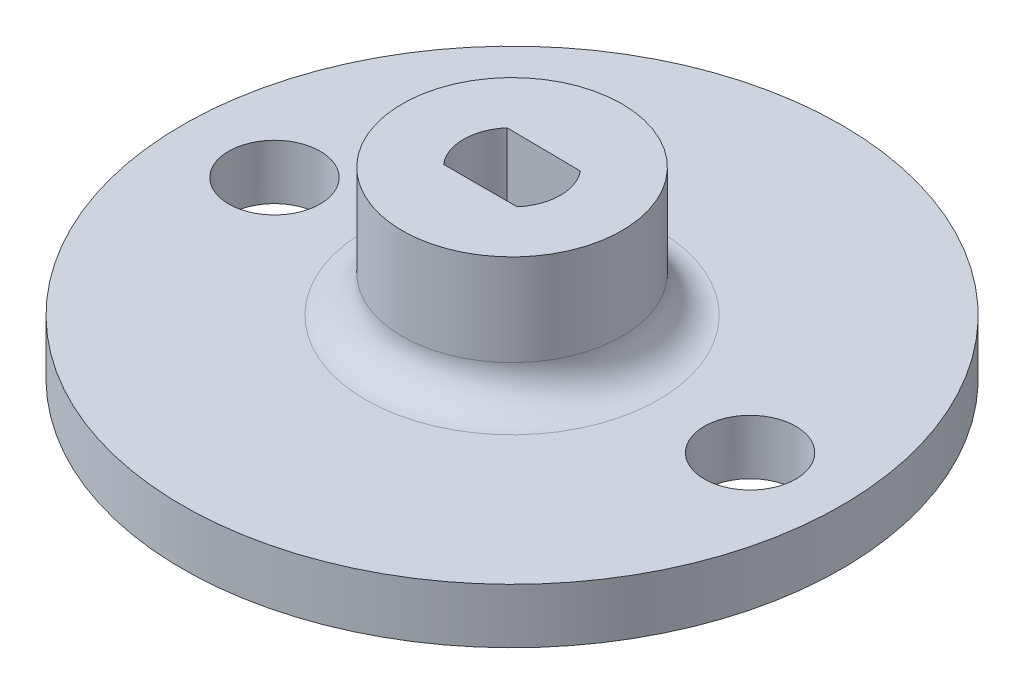
ISO-10303-21;
HEADER;
FILE_DESCRIPTION(('STEP AP214'),'2;1');
FILE_NAME('part.step','',(''),(''),'','','');
FILE_SCHEMA(('AUTOMOTIVE_DESIGN { 1 0 10303 214 1 1 1 1 }'));
ENDSEC;
DATA;
#1=APPLICATION_CONTEXT('core data for automotive mechanical design processes');
#2=APPLICATION_PROTOCOL_DEFINITION('international standard','automotive_design',2000,#1);
#3=PRODUCT_CONTEXT('',#1,'mechanical');
#4=PRODUCT('Part','Part','',(#3));
#5=PRODUCT_RELATED_PRODUCT_CATEGORY('part','',(#4));
#6=PRODUCT_DEFINITION_FORMATION('','',#4);
#7=PRODUCT_DEFINITION_CONTEXT('part definition',#1,'design');
#8=PRODUCT_DEFINITION('design','',#6,#7);
#9=PRODUCT_DEFINITION_SHAPE('','',#8);
#10=(LENGTH_UNIT() NAMED_UNIT(*) SI_UNIT(.MILLI.,.METRE.));
#11=(NAMED_UNIT(*) PLANE_ANGLE_UNIT() SI_UNIT($,.RADIAN.));
#12=(NAMED_UNIT(*) SI_UNIT($,.STERADIAN.) SOLID_ANGLE_UNIT());
#13=UNCERTAINTY_MEASURE_WITH_UNIT(LENGTH_MEASURE(1.E-05),#10,'distance_accuracy_value','');
#14=(GEOMETRIC_REPRESENTATION_CONTEXT(3) GLOBAL_UNCERTAINTY_ASSIGNED_CONTEXT((#13)) GLOBAL_UNIT_ASSIGNED_CONTEXT((#10,
#11,#12)) REPRESENTATION_CONTEXT('',''));
#15=CARTESIAN_POINT('',(0.,0.,0.));
#16=DIRECTION('',(0.,0.,1.));
#17=DIRECTION('',(1.,0.,0.));
#18=AXIS2_PLACEMENT_3D('',#15,#16,#17);
#19=CARTESIAN_POINT('',(0.,7.,0.));
#20=DIRECTION('',(0.,-1.,0.));
#21=DIRECTION('',(0.,0.,-1.));
#22=AXIS2_PLACEMENT_3D('',#19,#20,#21);
#23=CYLINDRICAL_SURFACE('',#22,6.);
#24=CARTESIAN_POINT('',(0.,2.,0.));
#25=DIRECTION('',(0.,-1.,0.));
#26=DIRECTION('',(0.,0.,-1.));
#27=AXIS2_PLACEMENT_3D('',#24,#25,#26);
#28=CIRCLE('',#27,6.);
#29=CARTESIAN_POINT('',(0.,2.,-6.));
#30=VERTEX_POINT('',#29);
#31=EDGE_CURVE('E43',#30,#30,#28,.F.);
#32=ORIENTED_EDGE('',*,*,#31,.T.);
#33=EDGE_LOOP('',(#32));
#34=FACE_BOUND('',#33,.T.);
#35=CARTESIAN_POINT('',(0.,7.,0.));
#36=DIRECTION('',(0.,1.,0.));
#37=DIRECTION('',(0.,0.,1.));
#38=AXIS2_PLACEMENT_3D('',#35,#36,#37);
#39=CIRCLE('',#38,6.);
#40=CARTESIAN_POINT('',(0.,7.,6.));
#41=VERTEX_POINT('',#40);
#42=EDGE_CURVE('E129',#41,#41,#39,.T.);
#43=ORIENTED_EDGE('',*,*,#42,.F.);
#44=EDGE_LOOP('',(#43));
#45=FACE_BOUND('',#44,.T.);
#46=ADVANCED_FACE('F35',(#34,#45),#23,.T.);
#47=CARTESIAN_POINT('',(0.,7.,0.));
#48=DIRECTION('',(0.,1.,0.));
#49=DIRECTION('',(0.,0.,1.));
#50=AXIS2_PLACEMENT_3D('',#47,#48,#49);
#51=PLANE('',#50);
#52=CARTESIAN_POINT('',(0.,7.,0.));
#53=DIRECTION('',(0.,1.,0.));
#54=DIRECTION('',(0.,0.,1.));
#55=AXIS2_PLACEMENT_3D('',#52,#53,#54);
#56=CIRCLE('',#55,2.65);
#57=CARTESIAN_POINT('',(-2.00415427824691,7.,-1.73374324194346));
#58=VERTEX_POINT('',#57);
#59=CARTESIAN_POINT('',(-2.00415427824691,7.,1.73374324194346));
#60=VERTEX_POINT('',#59);
#61=EDGE_CURVE('E50',#58,#60,#56,.T.);
#62=ORIENTED_EDGE('',*,*,#61,.F.);
#63=DIRECTION('',(-0.999932681439029,0.,-0.0116031284640242));
#64=VECTOR('',#63,1.);
#65=CARTESIAN_POINT('',(-2.00415427824691,7.,-1.73374324194346));
#66=LINE('',#65,#64);
#67=CARTESIAN_POINT('',(2.04384561192943,7.,-1.68677061706588));
#68=VERTEX_POINT('',#67);
#69=EDGE_CURVE('E101',#68,#58,#66,.T.);
#70=ORIENTED_EDGE('',*,*,#69,.F.);
#71=CARTESIAN_POINT('',(0.,7.,0.));
#72=DIRECTION('',(0.,1.,0.));
#73=DIRECTION('',(0.,0.,1.));
#74=AXIS2_PLACEMENT_3D('',#71,#72,#73);
#75=CIRCLE('',#74,2.65);
#76=CARTESIAN_POINT('',(2.00415427824691,7.,1.73374324194346));
#77=VERTEX_POINT('',#76);
#78=EDGE_CURVE('E107',#77,#68,#75,.T.);
#79=ORIENTED_EDGE('',*,*,#78,.F.);
#80=DIRECTION('',(1.,0.,0.));
#81=VECTOR('',#80,1.);
#82=CARTESIAN_POINT('',(-2.00415427824691,7.,1.73374324194346));
#83=LINE('',#82,#81);
#84=EDGE_CURVE('E85',#60,#77,#83,.T.);
#85=ORIENTED_EDGE('',*,*,#84,.F.);
#86=EDGE_LOOP('',(#62,#70,#79,#85));
#87=FACE_BOUND('',#86,.T.);
#88=ORIENTED_EDGE('',*,*,#42,.T.);
#89=EDGE_LOOP('',(#88));
#90=FACE_BOUND('',#89,.T.);
#91=ADVANCED_FACE('F154',(#87,#90),#51,.T.);
#92=CARTESIAN_POINT('',(0.,-3.,0.));
#93=DIRECTION('',(0.,1.,0.));
#94=DIRECTION('',(0.,0.,1.));
#95=AXIS2_PLACEMENT_3D('',#92,#93,#94);
#96=CYLINDRICAL_SURFACE('',#95,18.);
#97=CARTESIAN_POINT('',(0.,-3.,0.));
#98=DIRECTION('',(0.,-1.,0.));
#99=DIRECTION('',(0.,0.,-1.));
#100=AXIS2_PLACEMENT_3D('',#97,#98,#99);
#101=CIRCLE('',#100,18.);
#102=CARTESIAN_POINT('',(0.,-3.,-18.));
#103=VERTEX_POINT('',#102);
#104=EDGE_CURVE('E126',#103,#103,#101,.T.);
#105=ORIENTED_EDGE('',*,*,#104,.F.);
#106=EDGE_LOOP('',(#105));
#107=FACE_BOUND('',#106,.T.);
#108=CARTESIAN_POINT('',(0.,0.,0.));
#109=DIRECTION('',(0.,-1.,0.));
#110=DIRECTION('',(0.,0.,-1.));
#111=AXIS2_PLACEMENT_3D('',#108,#109,#110);
#112=CIRCLE('',#111,18.);
#113=CARTESIAN_POINT('',(0.,0.,-18.));
#114=VERTEX_POINT('',#113);
#115=EDGE_CURVE('E125',#114,#114,#112,.T.);
#116=ORIENTED_EDGE('',*,*,#115,.T.);
#117=EDGE_LOOP('',(#116));
#118=FACE_BOUND('',#117,.T.);
#119=ADVANCED_FACE('F159',(#107,#118),#96,.T.);
#120=CARTESIAN_POINT('',(0.,-3.,0.));
#121=DIRECTION('',(0.,-1.,0.));
#122=DIRECTION('',(0.,0.,-1.));
#123=AXIS2_PLACEMENT_3D('',#120,#121,#122);
#124=PLANE('',#123);
#125=CARTESIAN_POINT('',(13.,-3.,0.));
#126=DIRECTION('',(0.,-1.,0.));
#127=DIRECTION('',(0.,0.,-1.));
#128=AXIS2_PLACEMENT_3D('',#125,#126,#127);
#129=CIRCLE('',#128,2.5);
#130=CARTESIAN_POINT('',(13.,-3.,-2.5));
#131=VERTEX_POINT('',#130);
#132=EDGE_CURVE('E122',#131,#131,#129,.T.);
#133=ORIENTED_EDGE('',*,*,#132,.F.);
#134=EDGE_LOOP('',(#133));
#135=FACE_BOUND('',#134,.T.);
#136=CARTESIAN_POINT('',(-13.,-3.,-0.0220781952834113));
#137=DIRECTION('',(0.,-1.,0.));
#138=DIRECTION('',(0.,0.,-1.));
#139=AXIS2_PLACEMENT_3D('',#136,#137,#138);
#140=CIRCLE('',#139,2.5);
#141=CARTESIAN_POINT('',(-13.,-3.,-2.52207819528341));
#142=VERTEX_POINT('',#141);
#143=EDGE_CURVE('E117',#142,#142,#140,.T.);
#144=ORIENTED_EDGE('',*,*,#143,.F.);
#145=EDGE_LOOP('',(#144));
#146=FACE_BOUND('',#145,.T.);
#147=ORIENTED_EDGE('',*,*,#104,.T.);
#148=EDGE_LOOP('',(#147));
#149=FACE_BOUND('',#148,.T.);
#150=ADVANCED_FACE('F149',(#135,#146,#149),#124,.T.);
#151=CARTESIAN_POINT('',(0.,0.,0.));
#152=DIRECTION('',(0.,-1.,0.));
#153=DIRECTION('',(0.,0.,-1.));
#154=AXIS2_PLACEMENT_3D('',#151,#152,#153);
#155=PLANE('',#154);
#156=CARTESIAN_POINT('',(13.,0.,0.));
#157=DIRECTION('',(0.,1.,0.));
#158=DIRECTION('',(0.,0.,1.));
#159=AXIS2_PLACEMENT_3D('',#156,#157,#158);
#160=CIRCLE('',#159,2.5);
#161=CARTESIAN_POINT('',(13.,0.,2.5));
#162=VERTEX_POINT('',#161);
#163=EDGE_CURVE('E114',#162,#162,#160,.T.);
#164=ORIENTED_EDGE('',*,*,#163,.F.);
#165=EDGE_LOOP('',(#164));
#166=FACE_BOUND('',#165,.T.);
#167=CARTESIAN_POINT('',(-13.,0.,-0.0220781952834113));
#168=DIRECTION('',(0.,1.,0.));
#169=DIRECTION('',(0.,0.,1.));
#170=AXIS2_PLACEMENT_3D('',#167,#168,#169);
#171=CIRCLE('',#170,2.5);
#172=CARTESIAN_POINT('',(-13.,0.,2.47792180471659));
#173=VERTEX_POINT('',#172);
#174=EDGE_CURVE('E111',#173,#173,#171,.T.);
#175=ORIENTED_EDGE('',*,*,#174,.F.);
#176=EDGE_LOOP('',(#175));
#177=FACE_BOUND('',#176,.T.);
#178=CARTESIAN_POINT('',(0.,0.,0.));
#179=DIRECTION('',(0.,-1.,0.));
#180=DIRECTION('',(0.,0.,-1.));
#181=AXIS2_PLACEMENT_3D('',#178,#179,#180);
#182=CIRCLE('',#181,8.);
#183=CARTESIAN_POINT('',(0.,0.,-8.));
#184=VERTEX_POINT('',#183);
#185=EDGE_CURVE('E11',#184,#184,#182,.T.);
#186=ORIENTED_EDGE('',*,*,#185,.T.);
#187=EDGE_LOOP('',(#186));
#188=FACE_BOUND('',#187,.T.);
#189=ORIENTED_EDGE('',*,*,#115,.F.);
#190=EDGE_LOOP('',(#189));
#191=FACE_BOUND('',#190,.T.);
#192=ADVANCED_FACE('F140',(#166,#177,#188,#191),#155,.F.);
#193=CARTESIAN_POINT('',(0.,2.,0.));
#194=DIRECTION('',(0.,-1.,0.));
#195=DIRECTION('',(0.,0.,-1.));
#196=AXIS2_PLACEMENT_3D('',#193,#194,#195);
#197=TOROIDAL_SURFACE('',#196,8.,2.);
#198=ORIENTED_EDGE('',*,*,#185,.F.);
#199=EDGE_LOOP('',(#198));
#200=FACE_BOUND('',#199,.T.);
#201=ORIENTED_EDGE('',*,*,#31,.F.);
#202=EDGE_LOOP('',(#201));
#203=FACE_BOUND('',#202,.T.);
#204=ADVANCED_FACE('F37',(#200,#203),#197,.F.);
#205=CARTESIAN_POINT('',(-13.,-6.,-0.0220781952834113));
#206=DIRECTION('',(0.,1.,0.));
#207=DIRECTION('',(0.,0.,1.));
#208=AXIS2_PLACEMENT_3D('',#205,#206,#207);
#209=CYLINDRICAL_SURFACE('',#208,2.5);
#210=ORIENTED_EDGE('',*,*,#143,.T.);
#211=EDGE_LOOP('',(#210));
#212=FACE_BOUND('',#211,.T.);
#213=ORIENTED_EDGE('',*,*,#174,.T.);
#214=EDGE_LOOP('',(#213));
#215=FACE_BOUND('',#214,.T.);
#216=ADVANCED_FACE('F139',(#212,#215),#209,.F.);
#217=CARTESIAN_POINT('',(13.,-6.,0.));
#218=DIRECTION('',(0.,1.,0.));
#219=DIRECTION('',(0.,0.,1.));
#220=AXIS2_PLACEMENT_3D('',#217,#218,#219);
#221=CYLINDRICAL_SURFACE('',#220,2.5);
#222=ORIENTED_EDGE('',*,*,#132,.T.);
#223=EDGE_LOOP('',(#222));
#224=FACE_BOUND('',#223,.T.);
#225=ORIENTED_EDGE('',*,*,#163,.T.);
#226=EDGE_LOOP('',(#225));
#227=FACE_BOUND('',#226,.T.);
#228=ADVANCED_FACE('F146',(#224,#227),#221,.F.);
#229=CARTESIAN_POINT('',(0.,-1.,0.));
#230=DIRECTION('',(0.,1.,0.));
#231=DIRECTION('',(0.,0.,1.));
#232=AXIS2_PLACEMENT_3D('',#229,#230,#231);
#233=CYLINDRICAL_SURFACE('',#232,2.65);
#234=ORIENTED_EDGE('',*,*,#61,.T.);
#235=DIRECTION('',(0.,1.,0.));
#236=VECTOR('',#235,1.);
#237=CARTESIAN_POINT('',(-2.00415427824691,-1.,1.73374324194346));
#238=LINE('',#237,#236);
#239=CARTESIAN_POINT('',(-2.00415427824691,-1.,1.73374324194346));
#240=VERTEX_POINT('',#239);
#241=EDGE_CURVE('E73',#240,#60,#238,.T.);
#242=ORIENTED_EDGE('',*,*,#241,.F.);
#243=CARTESIAN_POINT('',(0.,-1.,0.));
#244=DIRECTION('',(0.,1.,0.));
#245=DIRECTION('',(0.,0.,1.));
#246=AXIS2_PLACEMENT_3D('',#243,#244,#245);
#247=CIRCLE('',#246,2.65);
#248=CARTESIAN_POINT('',(-2.00415427824691,-1.,-1.73374324194346));
#249=VERTEX_POINT('',#248);
#250=EDGE_CURVE('E99',#249,#240,#247,.T.);
#251=ORIENTED_EDGE('',*,*,#250,.F.);
#252=DIRECTION('',(0.,1.,0.));
#253=VECTOR('',#252,1.);
#254=CARTESIAN_POINT('',(-2.00415427824691,-1.,-1.73374324194346));
#255=LINE('',#254,#253);
#256=EDGE_CURVE('E58',#249,#58,#255,.T.);
#257=ORIENTED_EDGE('',*,*,#256,.T.);
#258=EDGE_LOOP('',(#234,#242,#251,#257));
#259=FACE_BOUND('',#258,.T.);
#260=ADVANCED_FACE('F171',(#259),#233,.F.);
#261=CARTESIAN_POINT('',(-2.00415427824691,-1.,-1.73374324194346));
#262=DIRECTION('',(0.0116031284640243,0.,-0.999932681439029));
#263=DIRECTION('',(-0.999932681439029,0.,-0.0116031284640243));
#264=AXIS2_PLACEMENT_3D('',#261,#262,#263);
#265=PLANE('',#264);
#266=ORIENTED_EDGE('',*,*,#69,.T.);
#267=ORIENTED_EDGE('',*,*,#256,.F.);
#268=DIRECTION('',(-0.999932681439029,0.,-0.0116031284640242));
#269=VECTOR('',#268,1.);
#270=CARTESIAN_POINT('',(-2.00415427824691,-1.,-1.73374324194346));
#271=LINE('',#270,#269);
#272=CARTESIAN_POINT('',(2.04384561192943,-1.,-1.68677061706588));
#273=VERTEX_POINT('',#272);
#274=EDGE_CURVE('E96',#273,#249,#271,.T.);
#275=ORIENTED_EDGE('',*,*,#274,.F.);
#276=DIRECTION('',(0.,1.,0.));
#277=VECTOR('',#276,1.);
#278=CARTESIAN_POINT('',(2.04384561192943,-1.,-1.68677061706588));
#279=LINE('',#278,#277);
#280=EDGE_CURVE('E89',#273,#68,#279,.T.);
#281=ORIENTED_EDGE('',*,*,#280,.T.);
#282=EDGE_LOOP('',(#266,#267,#275,#281));
#283=FACE_BOUND('',#282,.T.);
#284=ADVANCED_FACE('F175',(#283),#265,.F.);
#285=CARTESIAN_POINT('',(0.,-1.,0.));
#286=DIRECTION('',(0.,1.,0.));
#287=DIRECTION('',(0.,0.,1.));
#288=AXIS2_PLACEMENT_3D('',#285,#286,#287);
#289=CYLINDRICAL_SURFACE('',#288,2.65);
#290=ORIENTED_EDGE('',*,*,#78,.T.);
#291=ORIENTED_EDGE('',*,*,#280,.F.);
#292=CARTESIAN_POINT('',(0.,-1.,0.));
#293=DIRECTION('',(0.,1.,0.));
#294=DIRECTION('',(0.,0.,1.));
#295=AXIS2_PLACEMENT_3D('',#292,#293,#294);
#296=CIRCLE('',#295,2.65);
#297=CARTESIAN_POINT('',(2.00415427824691,-1.,1.73374324194346));
#298=VERTEX_POINT('',#297);
#299=EDGE_CURVE('E92',#298,#273,#296,.T.);
#300=ORIENTED_EDGE('',*,*,#299,.F.);
#301=DIRECTION('',(0.,1.,0.));
#302=VECTOR('',#301,1.);
#303=CARTESIAN_POINT('',(2.00415427824691,-1.,1.73374324194346));
#304=LINE('',#303,#302);
#305=EDGE_CURVE('E78',#298,#77,#304,.T.);
#306=ORIENTED_EDGE('',*,*,#305,.T.);
#307=EDGE_LOOP('',(#290,#291,#300,#306));
#308=FACE_BOUND('',#307,.T.);
#309=ADVANCED_FACE('F93',(#308),#289,.F.);
#310=CARTESIAN_POINT('',(-2.00415427824691,-1.,1.73374324194346));
#311=DIRECTION('',(0.,0.,1.));
#312=DIRECTION('',(1.,0.,0.));
#313=AXIS2_PLACEMENT_3D('',#310,#311,#312);
#314=PLANE('',#313);
#315=ORIENTED_EDGE('',*,*,#84,.T.);
#316=ORIENTED_EDGE('',*,*,#305,.F.);
#317=DIRECTION('',(1.,0.,0.));
#318=VECTOR('',#317,1.);
#319=CARTESIAN_POINT('',(-2.00415427824691,-1.,1.73374324194346));
#320=LINE('',#319,#318);
#321=EDGE_CURVE('E82',#240,#298,#320,.T.);
#322=ORIENTED_EDGE('',*,*,#321,.F.);
#323=ORIENTED_EDGE('',*,*,#241,.T.);
#324=EDGE_LOOP('',(#315,#316,#322,#323));
#325=FACE_BOUND('',#324,.T.);
#326=ADVANCED_FACE('F80',(#325),#314,.F.);
#327=CARTESIAN_POINT('',(0.,-1.,0.));
#328=DIRECTION('',(0.,1.,0.));
#329=DIRECTION('',(0.,0.,1.));
#330=AXIS2_PLACEMENT_3D('',#327,#328,#329);
#331=PLANE('',#330);
#332=ORIENTED_EDGE('',*,*,#250,.T.);
#333=ORIENTED_EDGE('',*,*,#321,.T.);
#334=ORIENTED_EDGE('',*,*,#299,.T.);
#335=ORIENTED_EDGE('',*,*,#274,.T.);
#336=EDGE_LOOP('',(#332,#333,#334,#335));
#337=FACE_BOUND('',#336,.T.);
#338=ADVANCED_FACE('F98',(#337),#331,.T.);
#339=CLOSED_SHELL('',(#46,#91,#119,#150,#192,#204,#216,#228,#260,#284,#309,#326,#338));
#340=MANIFOLD_SOLID_BREP('B2',#339);
#341=ADVANCED_BREP_SHAPE_REPRESENTATION('',(#18,#340),#14);
#342=SHAPE_DEFINITION_REPRESENTATION(#9,#341);
ENDSEC;
END-ISO-10303-21;
